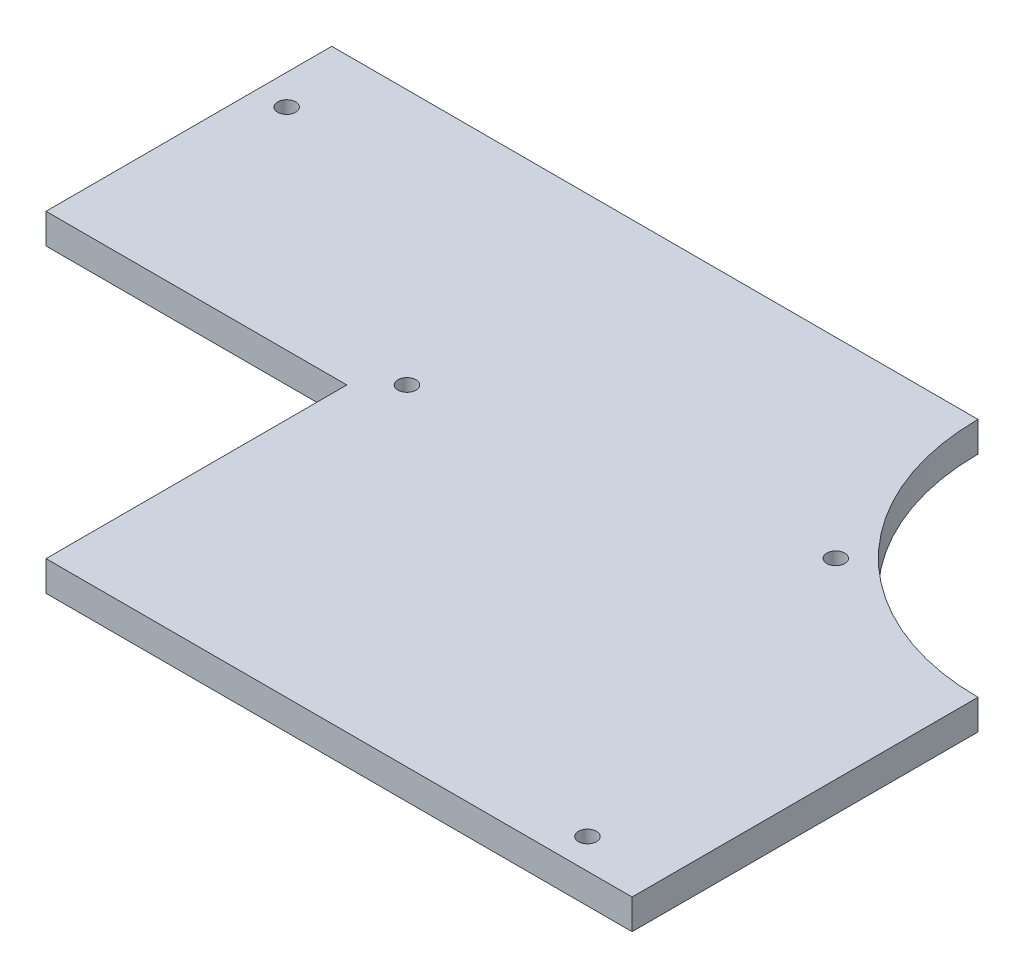
ISO-10303-21;
HEADER;
FILE_DESCRIPTION(('STEP AP214'),'2;1');
FILE_NAME('part.step','',(''),(''),'','','');
FILE_SCHEMA(('AUTOMOTIVE_DESIGN { 1 0 10303 214 1 1 1 1 }'));
ENDSEC;
DATA;
#1=APPLICATION_CONTEXT('core data for automotive mechanical design processes');
#2=APPLICATION_PROTOCOL_DEFINITION('international standard','automotive_design',2000,#1);
#3=PRODUCT_CONTEXT('',#1,'mechanical');
#4=PRODUCT('Part','Part','',(#3));
#5=PRODUCT_RELATED_PRODUCT_CATEGORY('part','',(#4));
#6=PRODUCT_DEFINITION_FORMATION('','',#4);
#7=PRODUCT_DEFINITION_CONTEXT('part definition',#1,'design');
#8=PRODUCT_DEFINITION('design','',#6,#7);
#9=PRODUCT_DEFINITION_SHAPE('','',#8);
#10=(LENGTH_UNIT() NAMED_UNIT(*) SI_UNIT(.MILLI.,.METRE.));
#11=(NAMED_UNIT(*) PLANE_ANGLE_UNIT() SI_UNIT($,.RADIAN.));
#12=(NAMED_UNIT(*) SI_UNIT($,.STERADIAN.) SOLID_ANGLE_UNIT());
#13=UNCERTAINTY_MEASURE_WITH_UNIT(LENGTH_MEASURE(1.E-05),#10,'distance_accuracy_value','');
#14=(GEOMETRIC_REPRESENTATION_CONTEXT(3) GLOBAL_UNCERTAINTY_ASSIGNED_CONTEXT((#13)) GLOBAL_UNIT_ASSIGNED_CONTEXT((#10,
#11,#12)) REPRESENTATION_CONTEXT('',''));
#15=CARTESIAN_POINT('',(0.,0.,0.));
#16=DIRECTION('',(0.,0.,1.));
#17=DIRECTION('',(1.,0.,0.));
#18=AXIS2_PLACEMENT_3D('',#15,#16,#17);
#19=CARTESIAN_POINT('',(0.,5.,-0.0850000000000178));
#20=DIRECTION('',(0.,-1.,0.));
#21=DIRECTION('',(0.,0.,-1.));
#22=AXIS2_PLACEMENT_3D('',#19,#20,#21);
#23=CYLINDRICAL_SURFACE('',#22,40.);
#24=CARTESIAN_POINT('',(0.,0.,-0.0850000000000178));
#25=DIRECTION('',(0.,1.,0.));
#26=DIRECTION('',(0.,0.,1.));
#27=AXIS2_PLACEMENT_3D('',#24,#25,#26);
#28=CIRCLE('',#27,40.);
#29=CARTESIAN_POINT('',(-40.,0.,-0.0849999999999933));
#30=VERTEX_POINT('',#29);
#31=CARTESIAN_POINT('',(0.,0.,39.915));
#32=VERTEX_POINT('',#31);
#33=EDGE_CURVE('E136',#30,#32,#28,.T.);
#34=ORIENTED_EDGE('',*,*,#33,.F.);
#35=DIRECTION('',(0.,-1.,0.));
#36=VECTOR('',#35,1.);
#37=CARTESIAN_POINT('',(-40.,5.,-0.0849999999999933));
#38=LINE('',#37,#36);
#39=CARTESIAN_POINT('',(-40.,5.,-0.0849999999999933));
#40=VERTEX_POINT('',#39);
#41=EDGE_CURVE('E11',#40,#30,#38,.T.);
#42=ORIENTED_EDGE('',*,*,#41,.F.);
#43=CARTESIAN_POINT('',(0.,5.,-0.0850000000000178));
#44=DIRECTION('',(0.,1.,0.));
#45=DIRECTION('',(0.,0.,1.));
#46=AXIS2_PLACEMENT_3D('',#43,#44,#45);
#47=CIRCLE('',#46,40.);
#48=CARTESIAN_POINT('',(0.,5.,39.915));
#49=VERTEX_POINT('',#48);
#50=EDGE_CURVE('E185',#40,#49,#47,.T.);
#51=ORIENTED_EDGE('',*,*,#50,.T.);
#52=DIRECTION('',(0.,-1.,0.));
#53=VECTOR('',#52,1.);
#54=CARTESIAN_POINT('',(0.,5.,39.915));
#55=LINE('',#54,#53);
#56=EDGE_CURVE('E83',#49,#32,#55,.T.);
#57=ORIENTED_EDGE('',*,*,#56,.T.);
#58=EDGE_LOOP('',(#34,#42,#51,#57));
#59=FACE_BOUND('',#58,.T.);
#60=ADVANCED_FACE('F35',(#59),#23,.F.);
#61=CARTESIAN_POINT('',(0.,5.,-0.0849999999999971));
#62=DIRECTION('',(0.,0.,-1.));
#63=DIRECTION('',(-1.,0.,0.));
#64=AXIS2_PLACEMENT_3D('',#61,#62,#63);
#65=PLANE('',#64);
#66=DIRECTION('',(1.,0.,0.));
#67=VECTOR('',#66,1.);
#68=CARTESIAN_POINT('',(0.,0.,-0.0849999999999971));
#69=LINE('',#68,#67);
#70=CARTESIAN_POINT('',(-147.415,0.,-0.0849999999999901));
#71=VERTEX_POINT('',#70);
#72=EDGE_CURVE('E139',#71,#30,#69,.T.);
#73=ORIENTED_EDGE('',*,*,#72,.F.);
#74=DIRECTION('',(0.,-1.,0.));
#75=VECTOR('',#74,1.);
#76=CARTESIAN_POINT('',(-147.415,5.,-0.0849999999999901));
#77=LINE('',#76,#75);
#78=CARTESIAN_POINT('',(-147.415,5.,-0.0849999999999901));
#79=VERTEX_POINT('',#78);
#80=EDGE_CURVE('E44',#79,#71,#77,.T.);
#81=ORIENTED_EDGE('',*,*,#80,.F.);
#82=DIRECTION('',(1.,0.,0.));
#83=VECTOR('',#82,1.);
#84=CARTESIAN_POINT('',(0.,5.,-0.0849999999999971));
#85=LINE('',#84,#83);
#86=EDGE_CURVE('E183',#79,#40,#85,.T.);
#87=ORIENTED_EDGE('',*,*,#86,.T.);
#88=ORIENTED_EDGE('',*,*,#41,.T.);
#89=EDGE_LOOP('',(#73,#81,#87,#88));
#90=FACE_BOUND('',#89,.T.);
#91=ADVANCED_FACE('F176',(#90),#65,.T.);
#92=CARTESIAN_POINT('',(-147.415,5.,0.));
#93=DIRECTION('',(-1.,0.,0.));
#94=DIRECTION('',(0.,0.,1.));
#95=AXIS2_PLACEMENT_3D('',#92,#93,#94);
#96=PLANE('',#95);
#97=DIRECTION('',(0.,0.,-1.));
#98=VECTOR('',#97,1.);
#99=CARTESIAN_POINT('',(-147.415,0.,0.));
#100=LINE('',#99,#98);
#101=CARTESIAN_POINT('',(-147.415,0.,47.415));
#102=VERTEX_POINT('',#101);
#103=EDGE_CURVE('E142',#102,#71,#100,.T.);
#104=ORIENTED_EDGE('',*,*,#103,.F.);
#105=DIRECTION('',(0.,-1.,0.));
#106=VECTOR('',#105,1.);
#107=CARTESIAN_POINT('',(-147.415,5.,47.415));
#108=LINE('',#107,#106);
#109=CARTESIAN_POINT('',(-147.415,5.,47.415));
#110=VERTEX_POINT('',#109);
#111=EDGE_CURVE('E166',#110,#102,#108,.T.);
#112=ORIENTED_EDGE('',*,*,#111,.F.);
#113=DIRECTION('',(0.,0.,-1.));
#114=VECTOR('',#113,1.);
#115=CARTESIAN_POINT('',(-147.415,5.,0.));
#116=LINE('',#115,#114);
#117=EDGE_CURVE('E172',#110,#79,#116,.T.);
#118=ORIENTED_EDGE('',*,*,#117,.T.);
#119=ORIENTED_EDGE('',*,*,#80,.T.);
#120=EDGE_LOOP('',(#104,#112,#118,#119));
#121=FACE_BOUND('',#120,.T.);
#122=ADVANCED_FACE('F171',(#121),#96,.T.);
#123=CARTESIAN_POINT('',(0.,5.,47.4149999999999));
#124=DIRECTION('',(0.,0.,-1.));
#125=DIRECTION('',(-1.,0.,0.));
#126=AXIS2_PLACEMENT_3D('',#123,#124,#125);
#127=PLANE('',#126);
#128=DIRECTION('',(1.,0.,0.));
#129=VECTOR('',#128,1.);
#130=CARTESIAN_POINT('',(0.,0.,47.4149999999999));
#131=LINE('',#130,#129);
#132=CARTESIAN_POINT('',(-97.415,0.,47.415));
#133=VERTEX_POINT('',#132);
#134=EDGE_CURVE('E145',#102,#133,#131,.T.);
#135=ORIENTED_EDGE('',*,*,#134,.T.);
#136=DIRECTION('',(0.,-1.,0.));
#137=VECTOR('',#136,1.);
#138=CARTESIAN_POINT('',(-97.415,5.,47.415));
#139=LINE('',#138,#137);
#140=CARTESIAN_POINT('',(-97.415,5.,47.415));
#141=VERTEX_POINT('',#140);
#142=EDGE_CURVE('E117',#141,#133,#139,.T.);
#143=ORIENTED_EDGE('',*,*,#142,.F.);
#144=DIRECTION('',(1.,0.,0.));
#145=VECTOR('',#144,1.);
#146=CARTESIAN_POINT('',(0.,5.,47.4149999999999));
#147=LINE('',#146,#145);
#148=EDGE_CURVE('E105',#110,#141,#147,.T.);
#149=ORIENTED_EDGE('',*,*,#148,.F.);
#150=ORIENTED_EDGE('',*,*,#111,.T.);
#151=EDGE_LOOP('',(#135,#143,#149,#150));
#152=FACE_BOUND('',#151,.T.);
#153=ADVANCED_FACE('F182',(#152),#127,.F.);
#154=CARTESIAN_POINT('',(-97.415,5.,0.));
#155=DIRECTION('',(1.,0.,0.));
#156=DIRECTION('',(0.,0.,-1.));
#157=AXIS2_PLACEMENT_3D('',#154,#155,#156);
#158=PLANE('',#157);
#159=DIRECTION('',(0.,0.,1.));
#160=VECTOR('',#159,1.);
#161=CARTESIAN_POINT('',(-97.415,0.,0.));
#162=LINE('',#161,#160);
#163=CARTESIAN_POINT('',(-97.415,0.,97.415));
#164=VERTEX_POINT('',#163);
#165=EDGE_CURVE('E113',#133,#164,#162,.T.);
#166=ORIENTED_EDGE('',*,*,#165,.T.);
#167=DIRECTION('',(0.,-1.,0.));
#168=VECTOR('',#167,1.);
#169=CARTESIAN_POINT('',(-97.415,5.,97.415));
#170=LINE('',#169,#168);
#171=CARTESIAN_POINT('',(-97.415,5.,97.415));
#172=VERTEX_POINT('',#171);
#173=EDGE_CURVE('E111',#172,#164,#170,.T.);
#174=ORIENTED_EDGE('',*,*,#173,.F.);
#175=DIRECTION('',(0.,0.,1.));
#176=VECTOR('',#175,1.);
#177=CARTESIAN_POINT('',(-97.415,5.,0.));
#178=LINE('',#177,#176);
#179=EDGE_CURVE('E97',#141,#172,#178,.T.);
#180=ORIENTED_EDGE('',*,*,#179,.F.);
#181=ORIENTED_EDGE('',*,*,#142,.T.);
#182=EDGE_LOOP('',(#166,#174,#180,#181));
#183=FACE_BOUND('',#182,.T.);
#184=ADVANCED_FACE('F112',(#183),#158,.F.);
#185=CARTESIAN_POINT('',(0.,5.,97.4149999999999));
#186=DIRECTION('',(0.,0.,1.));
#187=DIRECTION('',(1.,0.,0.));
#188=AXIS2_PLACEMENT_3D('',#185,#186,#187);
#189=PLANE('',#188);
#190=DIRECTION('',(-1.,0.,0.));
#191=VECTOR('',#190,1.);
#192=CARTESIAN_POINT('',(0.,0.,97.4149999999999));
#193=LINE('',#192,#191);
#194=CARTESIAN_POINT('',(0.,0.,97.4149999999999));
#195=VERTEX_POINT('',#194);
#196=EDGE_CURVE('E149',#195,#164,#193,.T.);
#197=ORIENTED_EDGE('',*,*,#196,.F.);
#198=DIRECTION('',(0.,-1.,0.));
#199=VECTOR('',#198,1.);
#200=CARTESIAN_POINT('',(0.,5.,97.4149999999999));
#201=LINE('',#200,#199);
#202=CARTESIAN_POINT('',(0.,5.,97.4149999999999));
#203=VERTEX_POINT('',#202);
#204=EDGE_CURVE('E76',#203,#195,#201,.T.);
#205=ORIENTED_EDGE('',*,*,#204,.F.);
#206=DIRECTION('',(-1.,0.,0.));
#207=VECTOR('',#206,1.);
#208=CARTESIAN_POINT('',(0.,5.,97.4149999999999));
#209=LINE('',#208,#207);
#210=EDGE_CURVE('E102',#203,#172,#209,.T.);
#211=ORIENTED_EDGE('',*,*,#210,.T.);
#212=ORIENTED_EDGE('',*,*,#173,.T.);
#213=EDGE_LOOP('',(#197,#205,#211,#212));
#214=FACE_BOUND('',#213,.T.);
#215=ADVANCED_FACE('F119',(#214),#189,.T.);
#216=CARTESIAN_POINT('',(-142.415,5.,12.415));
#217=DIRECTION('',(0.,-1.,0.));
#218=DIRECTION('',(0.,0.,-1.));
#219=AXIS2_PLACEMENT_3D('',#216,#217,#218);
#220=CYLINDRICAL_SURFACE('',#219,1.5);
#221=CARTESIAN_POINT('',(-142.415,5.,12.415));
#222=DIRECTION('',(0.,1.,0.));
#223=DIRECTION('',(0.,0.,1.));
#224=AXIS2_PLACEMENT_3D('',#221,#222,#223);
#225=CIRCLE('',#224,1.5);
#226=CARTESIAN_POINT('',(-142.415,5.,13.915));
#227=VERTEX_POINT('',#226);
#228=EDGE_CURVE('E127',#227,#227,#225,.T.);
#229=ORIENTED_EDGE('',*,*,#228,.T.);
#230=EDGE_LOOP('',(#229));
#231=FACE_BOUND('',#230,.T.);
#232=CARTESIAN_POINT('',(-142.415,0.,12.415));
#233=DIRECTION('',(0.,1.,0.));
#234=DIRECTION('',(0.,0.,1.));
#235=AXIS2_PLACEMENT_3D('',#232,#233,#234);
#236=CIRCLE('',#235,1.5);
#237=CARTESIAN_POINT('',(-142.415,0.,13.915));
#238=VERTEX_POINT('',#237);
#239=EDGE_CURVE('E156',#238,#238,#236,.T.);
#240=ORIENTED_EDGE('',*,*,#239,.F.);
#241=EDGE_LOOP('',(#240));
#242=FACE_BOUND('',#241,.T.);
#243=ADVANCED_FACE('F219',(#231,#242),#220,.F.);
#244=CARTESIAN_POINT('',(-12.415,5.,92.4149999999999));
#245=DIRECTION('',(0.,-1.,0.));
#246=DIRECTION('',(0.,0.,-1.));
#247=AXIS2_PLACEMENT_3D('',#244,#245,#246);
#248=CYLINDRICAL_SURFACE('',#247,1.5);
#249=CARTESIAN_POINT('',(-12.415,5.,92.4149999999999));
#250=DIRECTION('',(0.,1.,0.));
#251=DIRECTION('',(0.,0.,1.));
#252=AXIS2_PLACEMENT_3D('',#249,#250,#251);
#253=CIRCLE('',#252,1.5);
#254=CARTESIAN_POINT('',(-12.415,5.,93.9149999999999));
#255=VERTEX_POINT('',#254);
#256=EDGE_CURVE('E121',#255,#255,#253,.T.);
#257=ORIENTED_EDGE('',*,*,#256,.T.);
#258=EDGE_LOOP('',(#257));
#259=FACE_BOUND('',#258,.T.);
#260=CARTESIAN_POINT('',(-12.415,0.,92.4149999999999));
#261=DIRECTION('',(0.,1.,0.));
#262=DIRECTION('',(0.,0.,1.));
#263=AXIS2_PLACEMENT_3D('',#260,#261,#262);
#264=CIRCLE('',#263,1.5);
#265=CARTESIAN_POINT('',(-12.415,0.,93.9149999999999));
#266=VERTEX_POINT('',#265);
#267=EDGE_CURVE('E153',#266,#266,#264,.T.);
#268=ORIENTED_EDGE('',*,*,#267,.F.);
#269=EDGE_LOOP('',(#268));
#270=FACE_BOUND('',#269,.T.);
#271=ADVANCED_FACE('F223',(#259,#270),#248,.F.);
#272=CARTESIAN_POINT('',(0.,5.,0.));
#273=DIRECTION('',(-1.,0.,0.));
#274=DIRECTION('',(0.,0.,1.));
#275=AXIS2_PLACEMENT_3D('',#272,#273,#274);
#276=PLANE('',#275);
#277=DIRECTION('',(0.,0.,-1.));
#278=VECTOR('',#277,1.);
#279=CARTESIAN_POINT('',(0.,0.,0.));
#280=LINE('',#279,#278);
#281=EDGE_CURVE('E151',#195,#32,#280,.T.);
#282=ORIENTED_EDGE('',*,*,#281,.T.);
#283=ORIENTED_EDGE('',*,*,#56,.F.);
#284=DIRECTION('',(0.,0.,-1.));
#285=VECTOR('',#284,1.);
#286=CARTESIAN_POINT('',(0.,5.,0.));
#287=LINE('',#286,#285);
#288=EDGE_CURVE('E52',#203,#49,#287,.T.);
#289=ORIENTED_EDGE('',*,*,#288,.F.);
#290=ORIENTED_EDGE('',*,*,#204,.T.);
#291=EDGE_LOOP('',(#282,#283,#289,#290));
#292=FACE_BOUND('',#291,.T.);
#293=ADVANCED_FACE('F220',(#292),#276,.F.);
#294=CARTESIAN_POINT('',(-31.8198051533947,5.,31.7348051533946));
#295=DIRECTION('',(0.,-1.,0.));
#296=DIRECTION('',(0.,0.,-1.));
#297=AXIS2_PLACEMENT_3D('',#294,#295,#296);
#298=CYLINDRICAL_SURFACE('',#297,1.49999999999999);
#299=CARTESIAN_POINT('',(-31.8198051533947,5.,31.7348051533946));
#300=DIRECTION('',(0.,1.,0.));
#301=DIRECTION('',(0.,0.,1.));
#302=AXIS2_PLACEMENT_3D('',#299,#300,#301);
#303=CIRCLE('',#302,1.49999999999999);
#304=CARTESIAN_POINT('',(-31.8198051533947,5.,33.2348051533946));
#305=VERTEX_POINT('',#304);
#306=EDGE_CURVE('E162',#305,#305,#303,.T.);
#307=ORIENTED_EDGE('',*,*,#306,.T.);
#308=EDGE_LOOP('',(#307));
#309=FACE_BOUND('',#308,.T.);
#310=CARTESIAN_POINT('',(-31.8198051533947,0.,31.7348051533946));
#311=DIRECTION('',(0.,1.,0.));
#312=DIRECTION('',(0.,0.,1.));
#313=AXIS2_PLACEMENT_3D('',#310,#311,#312);
#314=CIRCLE('',#313,1.49999999999999);
#315=CARTESIAN_POINT('',(-31.8198051533947,0.,33.2348051533946));
#316=VERTEX_POINT('',#315);
#317=EDGE_CURVE('E133',#316,#316,#314,.T.);
#318=ORIENTED_EDGE('',*,*,#317,.F.);
#319=EDGE_LOOP('',(#318));
#320=FACE_BOUND('',#319,.T.);
#321=ADVANCED_FACE('F37',(#309,#320),#298,.F.);
#322=CARTESIAN_POINT('',(-92.4149999999999,5.,42.415));
#323=DIRECTION('',(0.,-1.,0.));
#324=DIRECTION('',(0.,0.,-1.));
#325=AXIS2_PLACEMENT_3D('',#322,#323,#324);
#326=CYLINDRICAL_SURFACE('',#325,1.5);
#327=CARTESIAN_POINT('',(-92.4149999999999,5.,42.415));
#328=DIRECTION('',(0.,1.,0.));
#329=DIRECTION('',(0.,0.,1.));
#330=AXIS2_PLACEMENT_3D('',#327,#328,#329);
#331=CIRCLE('',#330,1.5);
#332=CARTESIAN_POINT('',(-92.4149999999999,5.,43.915));
#333=VERTEX_POINT('',#332);
#334=EDGE_CURVE('E130',#333,#333,#331,.T.);
#335=ORIENTED_EDGE('',*,*,#334,.T.);
#336=EDGE_LOOP('',(#335));
#337=FACE_BOUND('',#336,.T.);
#338=CARTESIAN_POINT('',(-92.4149999999999,0.,42.415));
#339=DIRECTION('',(0.,1.,0.));
#340=DIRECTION('',(0.,0.,1.));
#341=AXIS2_PLACEMENT_3D('',#338,#339,#340);
#342=CIRCLE('',#341,1.5);
#343=CARTESIAN_POINT('',(-92.4149999999999,0.,43.915));
#344=VERTEX_POINT('',#343);
#345=EDGE_CURVE('E159',#344,#344,#342,.T.);
#346=ORIENTED_EDGE('',*,*,#345,.F.);
#347=EDGE_LOOP('',(#346));
#348=FACE_BOUND('',#347,.T.);
#349=ADVANCED_FACE('F195',(#337,#348),#326,.F.);
#350=CARTESIAN_POINT('',(0.,5.,0.));
#351=DIRECTION('',(0.,1.,0.));
#352=DIRECTION('',(0.,0.,1.));
#353=AXIS2_PLACEMENT_3D('',#350,#351,#352);
#354=PLANE('',#353);
#355=ORIENTED_EDGE('',*,*,#306,.F.);
#356=EDGE_LOOP('',(#355));
#357=FACE_BOUND('',#356,.T.);
#358=ORIENTED_EDGE('',*,*,#50,.F.);
#359=ORIENTED_EDGE('',*,*,#86,.F.);
#360=ORIENTED_EDGE('',*,*,#117,.F.);
#361=ORIENTED_EDGE('',*,*,#148,.T.);
#362=ORIENTED_EDGE('',*,*,#179,.T.);
#363=ORIENTED_EDGE('',*,*,#210,.F.);
#364=ORIENTED_EDGE('',*,*,#288,.T.);
#365=EDGE_LOOP('',(#358,#359,#360,#361,#362,#363,#364));
#366=FACE_BOUND('',#365,.T.);
#367=ORIENTED_EDGE('',*,*,#256,.F.);
#368=EDGE_LOOP('',(#367));
#369=FACE_BOUND('',#368,.T.);
#370=ORIENTED_EDGE('',*,*,#228,.F.);
#371=EDGE_LOOP('',(#370));
#372=FACE_BOUND('',#371,.T.);
#373=ORIENTED_EDGE('',*,*,#334,.F.);
#374=EDGE_LOOP('',(#373));
#375=FACE_BOUND('',#374,.T.);
#376=ADVANCED_FACE('F99',(#357,#366,#369,#372,#375),#354,.T.);
#377=CARTESIAN_POINT('',(0.,0.,0.));
#378=DIRECTION('',(0.,1.,0.));
#379=DIRECTION('',(0.,0.,1.));
#380=AXIS2_PLACEMENT_3D('',#377,#378,#379);
#381=PLANE('',#380);
#382=ORIENTED_EDGE('',*,*,#317,.T.);
#383=EDGE_LOOP('',(#382));
#384=FACE_BOUND('',#383,.T.);
#385=ORIENTED_EDGE('',*,*,#33,.T.);
#386=ORIENTED_EDGE('',*,*,#281,.F.);
#387=ORIENTED_EDGE('',*,*,#196,.T.);
#388=ORIENTED_EDGE('',*,*,#165,.F.);
#389=ORIENTED_EDGE('',*,*,#134,.F.);
#390=ORIENTED_EDGE('',*,*,#103,.T.);
#391=ORIENTED_EDGE('',*,*,#72,.T.);
#392=EDGE_LOOP('',(#385,#386,#387,#388,#389,#390,#391));
#393=FACE_BOUND('',#392,.T.);
#394=ORIENTED_EDGE('',*,*,#267,.T.);
#395=EDGE_LOOP('',(#394));
#396=FACE_BOUND('',#395,.T.);
#397=ORIENTED_EDGE('',*,*,#239,.T.);
#398=EDGE_LOOP('',(#397));
#399=FACE_BOUND('',#398,.T.);
#400=ORIENTED_EDGE('',*,*,#345,.T.);
#401=EDGE_LOOP('',(#400));
#402=FACE_BOUND('',#401,.T.);
#403=ADVANCED_FACE('F179',(#384,#393,#396,#399,#402),#381,.F.);
#404=CLOSED_SHELL('',(#60,#91,#122,#153,#184,#215,#243,#271,#293,#321,#349,#376,#403));
#405=MANIFOLD_SOLID_BREP('B2',#404);
#406=ADVANCED_BREP_SHAPE_REPRESENTATION('',(#18,#405),#14);
#407=SHAPE_DEFINITION_REPRESENTATION(#9,#406);
ENDSEC;
END-ISO-10303-21;
